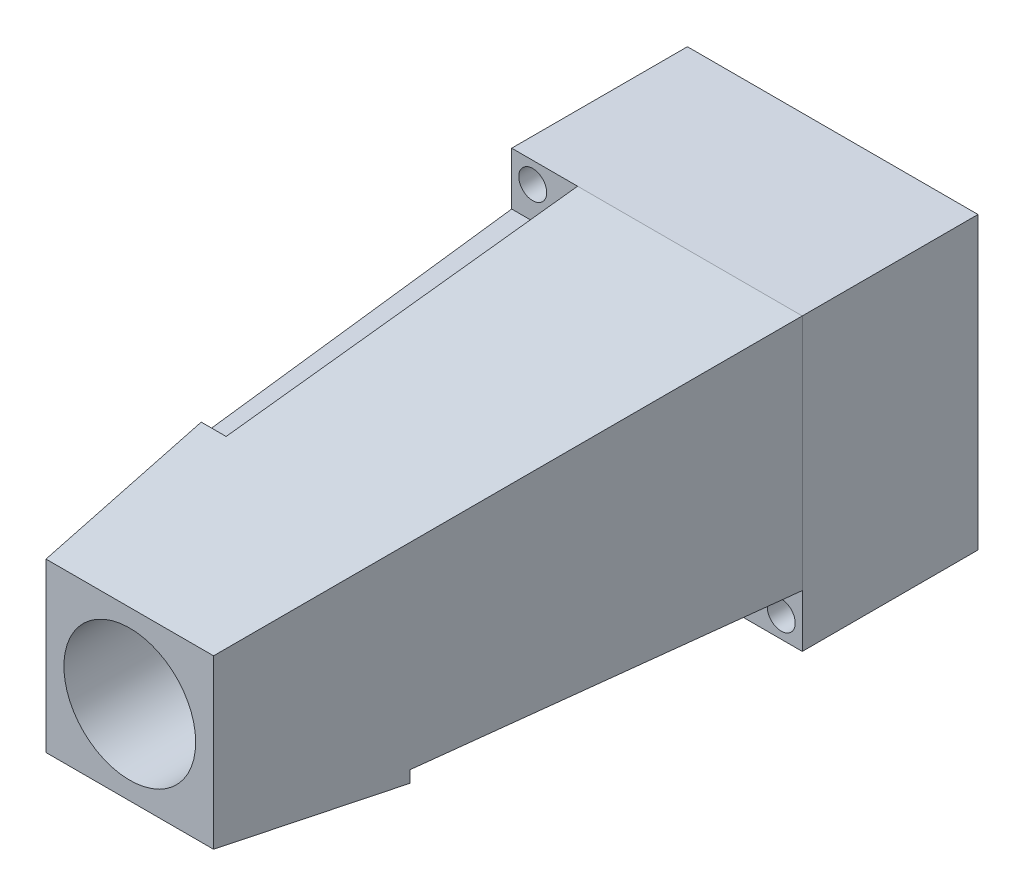
ISO-10303-21;
HEADER;
FILE_DESCRIPTION(('STEP AP214'),'2;1');
FILE_NAME('part.step','',(''),(''),'','','');
FILE_SCHEMA(('AUTOMOTIVE_DESIGN { 1 0 10303 214 1 1 1 1 }'));
ENDSEC;
DATA;
#1=APPLICATION_CONTEXT('core data for automotive mechanical design processes');
#2=APPLICATION_PROTOCOL_DEFINITION('international standard','automotive_design',2000,#1);
#3=PRODUCT_CONTEXT('',#1,'mechanical');
#4=PRODUCT('Part','Part','',(#3));
#5=PRODUCT_RELATED_PRODUCT_CATEGORY('part','',(#4));
#6=PRODUCT_DEFINITION_FORMATION('','',#4);
#7=PRODUCT_DEFINITION_CONTEXT('part definition',#1,'design');
#8=PRODUCT_DEFINITION('design','',#6,#7);
#9=PRODUCT_DEFINITION_SHAPE('','',#8);
#10=(LENGTH_UNIT() NAMED_UNIT(*) SI_UNIT(.MILLI.,.METRE.));
#11=(NAMED_UNIT(*) PLANE_ANGLE_UNIT() SI_UNIT($,.RADIAN.));
#12=(NAMED_UNIT(*) SI_UNIT($,.STERADIAN.) SOLID_ANGLE_UNIT());
#13=UNCERTAINTY_MEASURE_WITH_UNIT(LENGTH_MEASURE(1.E-05),#10,'distance_accuracy_value','');
#14=(GEOMETRIC_REPRESENTATION_CONTEXT(3) GLOBAL_UNCERTAINTY_ASSIGNED_CONTEXT((#13)) GLOBAL_UNIT_ASSIGNED_CONTEXT((#10,
#11,#12)) REPRESENTATION_CONTEXT('',''));
#15=CARTESIAN_POINT('',(0.,0.,0.));
#16=DIRECTION('',(0.,0.,1.));
#17=DIRECTION('',(1.,0.,0.));
#18=AXIS2_PLACEMENT_3D('',#15,#16,#17);
#19=CARTESIAN_POINT('',(0.358381047039892,0.,25.4));
#20=DIRECTION('',(-1.,0.,0.));
#21=DIRECTION('',(0.,-1.,0.));
#22=AXIS2_PLACEMENT_3D('',#19,#20,#21);
#23=PLANE('',#22);
#24=DIRECTION('',(0.,1.,0.));
#25=VECTOR('',#24,1.);
#26=CARTESIAN_POINT('',(0.358381047039892,0.,0.));
#27=LINE('',#26,#25);
#28=CARTESIAN_POINT('',(0.358381047039916,-94.4618953608133,0.));
#29=VERTEX_POINT('',#28);
#30=CARTESIAN_POINT('',(0.358381047039909,-69.0618953608133,0.));
#31=VERTEX_POINT('',#30);
#32=EDGE_CURVE('E410',#29,#31,#27,.T.);
#33=ORIENTED_EDGE('',*,*,#32,.F.);
#34=DIRECTION('',(0.,0.,-1.));
#35=VECTOR('',#34,1.);
#36=CARTESIAN_POINT('',(0.358381047039916,-94.4618953608133,25.4));
#37=LINE('',#36,#35);
#38=CARTESIAN_POINT('',(0.358381047039916,-94.4618953608133,25.4));
#39=VERTEX_POINT('',#38);
#40=EDGE_CURVE('E429',#39,#29,#37,.T.);
#41=ORIENTED_EDGE('',*,*,#40,.F.);
#42=DIRECTION('',(0.,1.,0.));
#43=VECTOR('',#42,1.);
#44=CARTESIAN_POINT('',(0.358381047039892,0.,25.4));
#45=LINE('',#44,#43);
#46=CARTESIAN_POINT('',(0.358381047039909,-69.0618953608133,25.4));
#47=VERTEX_POINT('',#46);
#48=EDGE_CURVE('E258',#39,#47,#45,.T.);
#49=ORIENTED_EDGE('',*,*,#48,.T.);
#50=DIRECTION('',(0.,0.,-1.));
#51=VECTOR('',#50,1.);
#52=CARTESIAN_POINT('',(0.358381047039909,-69.0618953608133,25.4));
#53=LINE('',#52,#51);
#54=EDGE_CURVE('E422',#47,#31,#53,.T.);
#55=ORIENTED_EDGE('',*,*,#54,.T.);
#56=EDGE_LOOP('',(#33,#41,#49,#55));
#57=FACE_BOUND('',#56,.T.);
#58=ADVANCED_FACE('F45',(#57),#23,.T.);
#59=CARTESIAN_POINT('',(0.,-94.4618953608133,25.4));
#60=DIRECTION('',(0.,-1.,0.));
#61=DIRECTION('',(0.,0.,-1.));
#62=AXIS2_PLACEMENT_3D('',#59,#60,#61);
#63=PLANE('',#62);
#64=DIRECTION('',(-1.,0.,0.));
#65=VECTOR('',#64,1.);
#66=CARTESIAN_POINT('',(0.,-94.4618953608133,0.));
#67=LINE('',#66,#65);
#68=CARTESIAN_POINT('',(-25.0416189529601,-94.4618953608133,0.));
#69=VERTEX_POINT('',#68);
#70=EDGE_CURVE('E413',#29,#69,#67,.T.);
#71=ORIENTED_EDGE('',*,*,#70,.T.);
#72=DIRECTION('',(0.,0.,-1.));
#73=VECTOR('',#72,1.);
#74=CARTESIAN_POINT('',(-25.0416189529601,-94.4618953608133,25.4));
#75=LINE('',#74,#73);
#76=CARTESIAN_POINT('',(-25.0416189529601,-94.4618953608133,25.4));
#77=VERTEX_POINT('',#76);
#78=EDGE_CURVE('E426',#77,#69,#75,.T.);
#79=ORIENTED_EDGE('',*,*,#78,.F.);
#80=DIRECTION('',(-1.,0.,0.));
#81=VECTOR('',#80,1.);
#82=CARTESIAN_POINT('',(0.,-94.4618953608133,25.4));
#83=LINE('',#82,#81);
#84=EDGE_CURVE('E385',#39,#77,#83,.T.);
#85=ORIENTED_EDGE('',*,*,#84,.F.);
#86=ORIENTED_EDGE('',*,*,#40,.T.);
#87=EDGE_LOOP('',(#71,#79,#85,#86));
#88=FACE_BOUND('',#87,.T.);
#89=ADVANCED_FACE('F480',(#88),#63,.F.);
#90=CARTESIAN_POINT('',(-25.0416189529601,0.,25.4));
#91=DIRECTION('',(-1.,0.,0.));
#92=DIRECTION('',(0.,-1.,0.));
#93=AXIS2_PLACEMENT_3D('',#90,#91,#92);
#94=PLANE('',#93);
#95=DIRECTION('',(0.,1.,0.));
#96=VECTOR('',#95,1.);
#97=CARTESIAN_POINT('',(-25.0416189529601,0.,0.));
#98=LINE('',#97,#96);
#99=CARTESIAN_POINT('',(-25.0416189529601,-69.0618953608133,0.));
#100=VERTEX_POINT('',#99);
#101=EDGE_CURVE('E416',#69,#100,#98,.T.);
#102=ORIENTED_EDGE('',*,*,#101,.T.);
#103=DIRECTION('',(0.,0.,-1.));
#104=VECTOR('',#103,1.);
#105=CARTESIAN_POINT('',(-25.0416189529601,-69.0618953608133,25.4));
#106=LINE('',#105,#104);
#107=CARTESIAN_POINT('',(-25.0416189529601,-69.0618953608133,25.4));
#108=VERTEX_POINT('',#107);
#109=EDGE_CURVE('E424',#108,#100,#106,.T.);
#110=ORIENTED_EDGE('',*,*,#109,.F.);
#111=DIRECTION('',(0.,1.,0.));
#112=VECTOR('',#111,1.);
#113=CARTESIAN_POINT('',(-25.0416189529601,0.,25.4));
#114=LINE('',#113,#112);
#115=EDGE_CURVE('E387',#77,#108,#114,.T.);
#116=ORIENTED_EDGE('',*,*,#115,.F.);
#117=ORIENTED_EDGE('',*,*,#78,.T.);
#118=EDGE_LOOP('',(#102,#110,#116,#117));
#119=FACE_BOUND('',#118,.T.);
#120=ADVANCED_FACE('F486',(#119),#94,.F.);
#121=CARTESIAN_POINT('',(-33.3416189530143,0.,25.4));
#122=DIRECTION('',(-1.,0.,0.));
#123=DIRECTION('',(0.,-1.,0.));
#124=AXIS2_PLACEMENT_3D('',#121,#122,#123);
#125=PLANE('',#124);
#126=DIRECTION('',(0.,1.,0.));
#127=VECTOR('',#126,1.);
#128=CARTESIAN_POINT('',(-33.3416189530143,0.,0.));
#129=LINE('',#128,#127);
#130=CARTESIAN_POINT('',(-33.3416189530143,-102.761895360813,0.));
#131=VERTEX_POINT('',#130);
#132=CARTESIAN_POINT('',(-33.3416189530143,-60.7618953608133,0.));
#133=VERTEX_POINT('',#132);
#134=EDGE_CURVE('E398',#131,#133,#129,.T.);
#135=ORIENTED_EDGE('',*,*,#134,.F.);
#136=DIRECTION('',(0.,0.,-1.));
#137=VECTOR('',#136,1.);
#138=CARTESIAN_POINT('',(-33.3416189530143,-102.761895360813,25.4));
#139=LINE('',#138,#137);
#140=CARTESIAN_POINT('',(-33.3416189530143,-102.761895360813,25.4));
#141=VERTEX_POINT('',#140);
#142=EDGE_CURVE('E251',#141,#131,#139,.T.);
#143=ORIENTED_EDGE('',*,*,#142,.F.);
#144=DIRECTION('',(0.,-1.,0.));
#145=VECTOR('',#144,1.);
#146=CARTESIAN_POINT('',(-33.3416189530143,0.,25.4));
#147=LINE('',#146,#145);
#148=CARTESIAN_POINT('',(-33.3416189530143,-68.3818953608133,25.4));
#149=VERTEX_POINT('',#148);
#150=EDGE_CURVE('E241',#141,#149,#147,.F.);
#151=ORIENTED_EDGE('',*,*,#150,.T.);
#152=CARTESIAN_POINT('',(-33.3416189530142,-60.7618953608133,25.4));
#153=VERTEX_POINT('',#152);
#154=EDGE_CURVE('E255',#149,#153,#147,.F.);
#155=ORIENTED_EDGE('',*,*,#154,.T.);
#156=DIRECTION('',(0.,0.,-1.));
#157=VECTOR('',#156,1.);
#158=CARTESIAN_POINT('',(-33.3416189530143,-60.7618953608133,25.4));
#159=LINE('',#158,#157);
#160=EDGE_CURVE('E392',#153,#133,#159,.T.);
#161=ORIENTED_EDGE('',*,*,#160,.T.);
#162=EDGE_LOOP('',(#135,#143,#151,#155,#161));
#163=FACE_BOUND('',#162,.T.);
#164=ADVANCED_FACE('F439',(#163),#125,.T.);
#165=CARTESIAN_POINT('',(0.,-102.761895360813,25.4));
#166=DIRECTION('',(0.,-1.,0.));
#167=DIRECTION('',(0.,0.,-1.));
#168=AXIS2_PLACEMENT_3D('',#165,#166,#167);
#169=PLANE('',#168);
#170=DIRECTION('',(-1.,0.,0.));
#171=VECTOR('',#170,1.);
#172=CARTESIAN_POINT('',(0.,-102.761895360813,0.));
#173=LINE('',#172,#171);
#174=CARTESIAN_POINT('',(8.65838104709408,-102.761895360813,0.));
#175=VERTEX_POINT('',#174);
#176=EDGE_CURVE('E401',#175,#131,#173,.T.);
#177=ORIENTED_EDGE('',*,*,#176,.F.);
#178=DIRECTION('',(0.,0.,-1.));
#179=VECTOR('',#178,1.);
#180=CARTESIAN_POINT('',(8.65838104709408,-102.761895360813,25.4));
#181=LINE('',#180,#179);
#182=CARTESIAN_POINT('',(8.65838104709406,-102.761895360813,25.4));
#183=VERTEX_POINT('',#182);
#184=EDGE_CURVE('E246',#183,#175,#181,.T.);
#185=ORIENTED_EDGE('',*,*,#184,.F.);
#186=DIRECTION('',(1.,0.,0.));
#187=VECTOR('',#186,1.);
#188=CARTESIAN_POINT('',(0.,-102.761895360813,25.4));
#189=LINE('',#188,#187);
#190=CARTESIAN_POINT('',(-0.86661895290592,-102.761895360813,25.4));
#191=VERTEX_POINT('',#190);
#192=EDGE_CURVE('E240',#183,#191,#189,.F.);
#193=ORIENTED_EDGE('',*,*,#192,.T.);
#194=EDGE_CURVE('E234',#191,#141,#189,.F.);
#195=ORIENTED_EDGE('',*,*,#194,.T.);
#196=ORIENTED_EDGE('',*,*,#142,.T.);
#197=EDGE_LOOP('',(#177,#185,#193,#195,#196));
#198=FACE_BOUND('',#197,.T.);
#199=ADVANCED_FACE('F245',(#198),#169,.T.);
#200=CARTESIAN_POINT('',(8.65838104709408,0.,25.4));
#201=DIRECTION('',(-1.,0.,0.));
#202=DIRECTION('',(0.,-1.,0.));
#203=AXIS2_PLACEMENT_3D('',#200,#201,#202);
#204=PLANE('',#203);
#205=DIRECTION('',(0.,1.,0.));
#206=VECTOR('',#205,1.);
#207=CARTESIAN_POINT('',(8.65838104709408,0.,0.));
#208=LINE('',#207,#206);
#209=CARTESIAN_POINT('',(8.65838104709408,-60.7618953608133,0.));
#210=VERTEX_POINT('',#209);
#211=EDGE_CURVE('E404',#175,#210,#208,.T.);
#212=ORIENTED_EDGE('',*,*,#211,.T.);
#213=DIRECTION('',(0.,0.,-1.));
#214=VECTOR('',#213,1.);
#215=CARTESIAN_POINT('',(8.65838104709408,-60.7618953608133,25.4));
#216=LINE('',#215,#214);
#217=CARTESIAN_POINT('',(8.65838104709408,-60.7618953608133,25.4));
#218=VERTEX_POINT('',#217);
#219=EDGE_CURVE('E432',#218,#210,#216,.T.);
#220=ORIENTED_EDGE('',*,*,#219,.F.);
#221=DIRECTION('',(0.,1.,0.));
#222=VECTOR('',#221,1.);
#223=CARTESIAN_POINT('',(8.65838104709408,0.,25.4));
#224=LINE('',#223,#222);
#225=CARTESIAN_POINT('',(8.65838104709408,-95.1418953608132,25.4));
#226=VERTEX_POINT('',#225);
#227=EDGE_CURVE('E247',#226,#218,#224,.T.);
#228=ORIENTED_EDGE('',*,*,#227,.F.);
#229=EDGE_CURVE('E178',#183,#226,#224,.T.);
#230=ORIENTED_EDGE('',*,*,#229,.F.);
#231=ORIENTED_EDGE('',*,*,#184,.T.);
#232=EDGE_LOOP('',(#212,#220,#228,#230,#231));
#233=FACE_BOUND('',#232,.T.);
#234=ADVANCED_FACE('F445',(#233),#204,.F.);
#235=CARTESIAN_POINT('',(0.,-60.7618953608133,25.4));
#236=DIRECTION('',(0.,-1.,0.));
#237=DIRECTION('',(0.,0.,-1.));
#238=AXIS2_PLACEMENT_3D('',#235,#236,#237);
#239=PLANE('',#238);
#240=DIRECTION('',(-1.,0.,0.));
#241=VECTOR('',#240,1.);
#242=CARTESIAN_POINT('',(0.,-60.7618953608133,0.));
#243=LINE('',#242,#241);
#244=EDGE_CURVE('E407',#210,#133,#243,.T.);
#245=ORIENTED_EDGE('',*,*,#244,.T.);
#246=ORIENTED_EDGE('',*,*,#160,.F.);
#247=DIRECTION('',(-1.,0.,0.));
#248=VECTOR('',#247,1.);
#249=CARTESIAN_POINT('',(-23.8166189530143,-60.7618953608133,25.4));
#250=LINE('',#249,#248);
#251=CARTESIAN_POINT('',(-23.8166189530143,-60.7618953608133,25.4));
#252=VERTEX_POINT('',#251);
#253=EDGE_CURVE('E192',#252,#153,#250,.T.);
#254=ORIENTED_EDGE('',*,*,#253,.F.);
#255=DIRECTION('',(1.,0.,0.));
#256=VECTOR('',#255,1.);
#257=CARTESIAN_POINT('',(0.,-60.7618953608133,25.4));
#258=LINE('',#257,#256);
#259=EDGE_CURVE('E256',#218,#252,#258,.F.);
#260=ORIENTED_EDGE('',*,*,#259,.F.);
#261=ORIENTED_EDGE('',*,*,#219,.T.);
#262=EDGE_LOOP('',(#245,#246,#254,#260,#261));
#263=FACE_BOUND('',#262,.T.);
#264=ADVANCED_FACE('F453',(#263),#239,.F.);
#265=CARTESIAN_POINT('',(-30.3021311950443,-63.801383118675,25.4));
#266=DIRECTION('',(0.,0.,-1.));
#267=DIRECTION('',(-1.,0.,0.));
#268=AXIS2_PLACEMENT_3D('',#265,#266,#267);
#269=CYLINDRICAL_SURFACE('',#268,2.01930000012077);
#270=CARTESIAN_POINT('',(-30.3021311950443,-63.801383118675,25.4));
#271=DIRECTION('',(0.,0.,1.));
#272=DIRECTION('',(1.,0.,0.));
#273=AXIS2_PLACEMENT_3D('',#270,#271,#272);
#274=CIRCLE('',#273,2.01930000012077);
#275=CARTESIAN_POINT('',(-28.2828311949235,-63.801383118675,25.4));
#276=VERTEX_POINT('',#275);
#277=EDGE_CURVE('E203',#276,#276,#274,.T.);
#278=ORIENTED_EDGE('',*,*,#277,.T.);
#279=EDGE_LOOP('',(#278));
#280=FACE_BOUND('',#279,.T.);
#281=CARTESIAN_POINT('',(-30.3021311950443,-63.801383118675,0.));
#282=DIRECTION('',(0.,0.,1.));
#283=DIRECTION('',(1.,0.,0.));
#284=AXIS2_PLACEMENT_3D('',#281,#282,#283);
#285=CIRCLE('',#284,2.01930000012077);
#286=CARTESIAN_POINT('',(-28.2828311949235,-63.801383118675,0.));
#287=VERTEX_POINT('',#286);
#288=EDGE_CURVE('E395',#287,#287,#285,.T.);
#289=ORIENTED_EDGE('',*,*,#288,.F.);
#290=EDGE_LOOP('',(#289));
#291=FACE_BOUND('',#290,.T.);
#292=ADVANCED_FACE('F494',(#280,#291),#269,.F.);
#293=CARTESIAN_POINT('',(5.61889328923248,-99.7224076029515,25.4));
#294=DIRECTION('',(0.,0.,-1.));
#295=DIRECTION('',(-1.,0.,0.));
#296=AXIS2_PLACEMENT_3D('',#293,#294,#295);
#297=CYLINDRICAL_SURFACE('',#296,2.01930000012066);
#298=CARTESIAN_POINT('',(5.61889328923248,-99.7224076029515,25.4));
#299=DIRECTION('',(0.,0.,1.));
#300=DIRECTION('',(1.,0.,0.));
#301=AXIS2_PLACEMENT_3D('',#298,#299,#300);
#302=CIRCLE('',#301,2.01930000012066);
#303=CARTESIAN_POINT('',(7.63819328935314,-99.7224076029515,25.4));
#304=VERTEX_POINT('',#303);
#305=EDGE_CURVE('E187',#304,#304,#302,.T.);
#306=ORIENTED_EDGE('',*,*,#305,.T.);
#307=EDGE_LOOP('',(#306));
#308=FACE_BOUND('',#307,.T.);
#309=CARTESIAN_POINT('',(5.61889328923248,-99.7224076029515,0.));
#310=DIRECTION('',(0.,0.,1.));
#311=DIRECTION('',(1.,0.,0.));
#312=AXIS2_PLACEMENT_3D('',#309,#310,#311);
#313=CIRCLE('',#312,2.01930000012066);
#314=CARTESIAN_POINT('',(7.63819328935314,-99.7224076029515,0.));
#315=VERTEX_POINT('',#314);
#316=EDGE_CURVE('E327',#315,#315,#313,.T.);
#317=ORIENTED_EDGE('',*,*,#316,.F.);
#318=EDGE_LOOP('',(#317));
#319=FACE_BOUND('',#318,.T.);
#320=ADVANCED_FACE('F47',(#308,#319),#297,.F.);
#321=CARTESIAN_POINT('',(0.,-69.0618953608133,25.4));
#322=DIRECTION('',(0.,-1.,0.));
#323=DIRECTION('',(0.,0.,-1.));
#324=AXIS2_PLACEMENT_3D('',#321,#322,#323);
#325=PLANE('',#324);
#326=DIRECTION('',(-1.,0.,0.));
#327=VECTOR('',#326,1.);
#328=CARTESIAN_POINT('',(0.,-69.0618953608133,0.));
#329=LINE('',#328,#327);
#330=EDGE_CURVE('E419',#31,#100,#329,.T.);
#331=ORIENTED_EDGE('',*,*,#330,.F.);
#332=ORIENTED_EDGE('',*,*,#54,.F.);
#333=DIRECTION('',(-1.,0.,0.));
#334=VECTOR('',#333,1.);
#335=CARTESIAN_POINT('',(0.,-69.0618953608133,25.4));
#336=LINE('',#335,#334);
#337=EDGE_CURVE('E389',#47,#108,#336,.T.);
#338=ORIENTED_EDGE('',*,*,#337,.T.);
#339=ORIENTED_EDGE('',*,*,#109,.T.);
#340=EDGE_LOOP('',(#331,#332,#338,#339));
#341=FACE_BOUND('',#340,.T.);
#342=ADVANCED_FACE('F505',(#341),#325,.T.);
#343=CARTESIAN_POINT('',(0.,0.,0.));
#344=DIRECTION('',(0.,0.,1.));
#345=DIRECTION('',(1.,0.,0.));
#346=AXIS2_PLACEMENT_3D('',#343,#344,#345);
#347=PLANE('',#346);
#348=ORIENTED_EDGE('',*,*,#316,.T.);
#349=EDGE_LOOP('',(#348));
#350=FACE_BOUND('',#349,.T.);
#351=ORIENTED_EDGE('',*,*,#288,.T.);
#352=EDGE_LOOP('',(#351));
#353=FACE_BOUND('',#352,.T.);
#354=ORIENTED_EDGE('',*,*,#134,.T.);
#355=ORIENTED_EDGE('',*,*,#244,.F.);
#356=ORIENTED_EDGE('',*,*,#211,.F.);
#357=ORIENTED_EDGE('',*,*,#176,.T.);
#358=EDGE_LOOP('',(#354,#355,#356,#357));
#359=FACE_BOUND('',#358,.T.);
#360=ORIENTED_EDGE('',*,*,#32,.T.);
#361=ORIENTED_EDGE('',*,*,#330,.T.);
#362=ORIENTED_EDGE('',*,*,#101,.F.);
#363=ORIENTED_EDGE('',*,*,#70,.F.);
#364=EDGE_LOOP('',(#360,#361,#362,#363));
#365=FACE_BOUND('',#364,.T.);
#366=ADVANCED_FACE('F350',(#350,#353,#359,#365),#347,.F.);
#367=CARTESIAN_POINT('',(0.,0.,25.4));
#368=DIRECTION('',(0.,0.,-1.));
#369=DIRECTION('',(-1.,0.,0.));
#370=AXIS2_PLACEMENT_3D('',#367,#368,#369);
#371=PLANE('',#370);
#372=CARTESIAN_POINT('',(-12.3416189528054,-81.7618953608125,25.4));
#373=DIRECTION('',(0.,0.,-1.));
#374=DIRECTION('',(-1.,0.,0.));
#375=AXIS2_PLACEMENT_3D('',#372,#373,#374);
#376=CIRCLE('',#375,9.52500000000001);
#377=CARTESIAN_POINT('',(-21.8666189528054,-81.7618953608125,25.4));
#378=VERTEX_POINT('',#377);
#379=EDGE_CURVE('E212',#378,#378,#376,.T.);
#380=ORIENTED_EDGE('',*,*,#379,.F.);
#381=EDGE_LOOP('',(#380));
#382=FACE_BOUND('',#381,.T.);
#383=ORIENTED_EDGE('',*,*,#48,.F.);
#384=ORIENTED_EDGE('',*,*,#84,.T.);
#385=ORIENTED_EDGE('',*,*,#115,.T.);
#386=ORIENTED_EDGE('',*,*,#337,.F.);
#387=EDGE_LOOP('',(#383,#384,#385,#386));
#388=FACE_BOUND('',#387,.T.);
#389=ADVANCED_FACE('F348',(#382,#388),#371,.T.);
#390=CARTESIAN_POINT('',(0.,0.,101.6));
#391=DIRECTION('',(0.,0.,-1.));
#392=DIRECTION('',(-1.,0.,0.));
#393=AXIS2_PLACEMENT_3D('',#390,#391,#392);
#394=PLANE('',#393);
#395=CARTESIAN_POINT('',(-12.3416189528054,-81.7618953608125,101.6));
#396=DIRECTION('',(0.,0.,1.));
#397=DIRECTION('',(1.,0.,0.));
#398=AXIS2_PLACEMENT_3D('',#395,#396,#397);
#399=CIRCLE('',#398,9.52500000000001);
#400=CARTESIAN_POINT('',(-2.81661895280538,-81.7618953608125,101.6));
#401=VERTEX_POINT('',#400);
#402=EDGE_CURVE('E209',#401,#401,#399,.T.);
#403=ORIENTED_EDGE('',*,*,#402,.F.);
#404=EDGE_LOOP('',(#403));
#405=FACE_BOUND('',#404,.T.);
#406=DIRECTION('',(1.,0.,0.));
#407=VECTOR('',#406,1.);
#408=CARTESIAN_POINT('',(-0.231618952805554,-93.8718953608125,101.6));
#409=LINE('',#408,#407);
#410=CARTESIAN_POINT('',(-24.4516189528052,-93.8718953608125,101.6));
#411=VERTEX_POINT('',#410);
#412=CARTESIAN_POINT('',(-0.231618952805554,-93.8718953608125,101.6));
#413=VERTEX_POINT('',#412);
#414=EDGE_CURVE('E224',#411,#413,#409,.T.);
#415=ORIENTED_EDGE('',*,*,#414,.T.);
#416=DIRECTION('',(0.,1.,0.));
#417=VECTOR('',#416,1.);
#418=CARTESIAN_POINT('',(-0.231618952805554,-93.8718953608125,101.6));
#419=LINE('',#418,#417);
#420=CARTESIAN_POINT('',(-0.231618952805554,-69.6518953608125,101.6));
#421=VERTEX_POINT('',#420);
#422=EDGE_CURVE('E273',#413,#421,#419,.T.);
#423=ORIENTED_EDGE('',*,*,#422,.T.);
#424=DIRECTION('',(-1.,0.,0.));
#425=VECTOR('',#424,1.);
#426=CARTESIAN_POINT('',(-0.231618952805554,-69.6518953608125,101.6));
#427=LINE('',#426,#425);
#428=CARTESIAN_POINT('',(-24.4516189528052,-69.6518953608125,101.6));
#429=VERTEX_POINT('',#428);
#430=EDGE_CURVE('E328',#421,#429,#427,.T.);
#431=ORIENTED_EDGE('',*,*,#430,.T.);
#432=DIRECTION('',(0.,-1.,0.));
#433=VECTOR('',#432,1.);
#434=CARTESIAN_POINT('',(-24.4516189528052,-93.8718953608125,101.6));
#435=LINE('',#434,#433);
#436=EDGE_CURVE('E364',#429,#411,#435,.T.);
#437=ORIENTED_EDGE('',*,*,#436,.T.);
#438=EDGE_LOOP('',(#415,#423,#431,#437));
#439=FACE_BOUND('',#438,.T.);
#440=ADVANCED_FACE('F339',(#405,#439),#394,.F.);
#441=CARTESIAN_POINT('',(0.,-57.0224234855931,-6.65261607331861));
#442=DIRECTION('',(0.,-0.993263139087244,-0.115880699560168));
#443=DIRECTION('',(0.,0.115880699560168,-0.993263139087244));
#444=AXIS2_PLACEMENT_3D('',#441,#442,#443);
#445=PLANE('',#444);
#446=ORIENTED_EDGE('',*,*,#259,.T.);
#447=DIRECTION('',(0.,-0.115880699560168,0.993263139087244));
#448=VECTOR('',#447,1.);
#449=CARTESIAN_POINT('',(-23.8166189530142,-57.0224234855931,-6.65261607331862));
#450=LINE('',#449,#448);
#451=CARTESIAN_POINT('',(-23.8166189530143,-66.6885620274794,76.2));
#452=VERTEX_POINT('',#451);
#453=EDGE_CURVE('E226',#252,#452,#450,.T.);
#454=ORIENTED_EDGE('',*,*,#453,.T.);
#455=DIRECTION('',(-1.,0.,0.));
#456=VECTOR('',#455,1.);
#457=CARTESIAN_POINT('',(0.,-66.6885620274794,76.2));
#458=LINE('',#457,#456);
#459=CARTESIAN_POINT('',(-27.4149522862082,-66.6885620274794,76.2));
#460=VERTEX_POINT('',#459);
#461=EDGE_CURVE('E206',#452,#460,#458,.T.);
#462=ORIENTED_EDGE('',*,*,#461,.T.);
#463=DIRECTION('',(0.115110406242341,-0.115110406239625,0.986660624911155));
#464=VECTOR('',#463,1.);
#465=CARTESIAN_POINT('',(-33.3416189530143,-60.7618953608133,25.4));
#466=LINE('',#465,#464);
#467=EDGE_CURVE('E215',#460,#429,#466,.T.);
#468=ORIENTED_EDGE('',*,*,#467,.T.);
#469=ORIENTED_EDGE('',*,*,#430,.F.);
#470=DIRECTION('',(-0.115110406238388,-0.115110406239678,0.98666062491161));
#471=VECTOR('',#470,1.);
#472=CARTESIAN_POINT('',(8.65838104709408,-60.7618953608133,25.4));
#473=LINE('',#472,#471);
#474=EDGE_CURVE('E218',#218,#421,#473,.T.);
#475=ORIENTED_EDGE('',*,*,#474,.F.);
#476=EDGE_LOOP('',(#446,#454,#462,#468,#469,#475));
#477=FACE_BOUND('',#476,.T.);
#478=ADVANCED_FACE('F292',(#477),#445,.F.);
#479=CARTESIAN_POINT('',(11.4656540886355,0.,1.33765964365904));
#480=DIRECTION('',(-0.993263139087393,0.,-0.115880699558888));
#481=DIRECTION('',(-0.115880699558888,0.,0.993263139087393));
#482=AXIS2_PLACEMENT_3D('',#479,#480,#481);
#483=PLANE('',#482);
#484=DIRECTION('',(-0.115110406238388,0.115110406239698,0.986660624911608));
#485=VECTOR('',#484,1.);
#486=CARTESIAN_POINT('',(8.65838104709408,-102.761895360813,25.4));
#487=LINE('',#486,#485);
#488=CARTESIAN_POINT('',(2.73171438049433,-96.8352286941461,76.2));
#489=VERTEX_POINT('',#488);
#490=EDGE_CURVE('E221',#489,#413,#487,.T.);
#491=ORIENTED_EDGE('',*,*,#490,.F.);
#492=DIRECTION('',(0.,1.,0.));
#493=VECTOR('',#492,1.);
#494=CARTESIAN_POINT('',(2.73171438049433,0.,76.2));
#495=LINE('',#494,#493);
#496=CARTESIAN_POINT('',(2.73171438049433,-95.1418953608132,76.2));
#497=VERTEX_POINT('',#496);
#498=EDGE_CURVE('E189',#489,#497,#495,.T.);
#499=ORIENTED_EDGE('',*,*,#498,.T.);
#500=DIRECTION('',(0.115880699558888,0.,-0.993263139087393));
#501=VECTOR('',#500,1.);
#502=CARTESIAN_POINT('',(11.4656540886355,-95.1418953608132,1.33765964365904));
#503=LINE('',#502,#501);
#504=EDGE_CURVE('E12',#497,#226,#503,.T.);
#505=ORIENTED_EDGE('',*,*,#504,.T.);
#506=ORIENTED_EDGE('',*,*,#227,.T.);
#507=ORIENTED_EDGE('',*,*,#474,.T.);
#508=ORIENTED_EDGE('',*,*,#422,.F.);
#509=EDGE_LOOP('',(#491,#499,#505,#506,#507,#508));
#510=FACE_BOUND('',#509,.T.);
#511=ADVANCED_FACE('F281',(#510),#483,.F.);
#512=CARTESIAN_POINT('',(-35.8174371693668,0.,4.17870100319105));
#513=DIRECTION('',(0.993263139086929,0.,-0.115880699562866));
#514=DIRECTION('',(-0.115880699562866,0.,-0.993263139086929));
#515=AXIS2_PLACEMENT_3D('',#512,#513,#514);
#516=PLANE('',#515);
#517=ORIENTED_EDGE('',*,*,#467,.F.);
#518=DIRECTION('',(0.,-1.,0.));
#519=VECTOR('',#518,1.);
#520=CARTESIAN_POINT('',(-27.4149522862082,0.,76.2));
#521=LINE('',#520,#519);
#522=CARTESIAN_POINT('',(-27.4149522862082,-68.3818953608133,76.2));
#523=VERTEX_POINT('',#522);
#524=EDGE_CURVE('E460',#460,#523,#521,.T.);
#525=ORIENTED_EDGE('',*,*,#524,.T.);
#526=DIRECTION('',(-0.115880699562866,0.,-0.993263139086929));
#527=VECTOR('',#526,1.);
#528=CARTESIAN_POINT('',(-35.8174371693668,-68.3818953608133,4.17870100319105));
#529=LINE('',#528,#527);
#530=EDGE_CURVE('E262',#523,#149,#529,.T.);
#531=ORIENTED_EDGE('',*,*,#530,.T.);
#532=ORIENTED_EDGE('',*,*,#150,.F.);
#533=DIRECTION('',(0.115110406242341,0.115110406239645,0.986660624911153));
#534=VECTOR('',#533,1.);
#535=CARTESIAN_POINT('',(-33.3416189530143,-102.761895360813,25.4));
#536=LINE('',#535,#534);
#537=EDGE_CURVE('E225',#141,#411,#536,.T.);
#538=ORIENTED_EDGE('',*,*,#537,.T.);
#539=ORIENTED_EDGE('',*,*,#436,.F.);
#540=EDGE_LOOP('',(#517,#525,#531,#532,#538,#539));
#541=FACE_BOUND('',#540,.T.);
#542=ADVANCED_FACE('F291',(#541),#516,.F.);
#543=CARTESIAN_POINT('',(0.,-104.305514743472,12.1689767200727));
#544=DIRECTION('',(0.,0.993263139087242,-0.115880699560188));
#545=DIRECTION('',(0.,0.115880699560188,0.993263139087242));
#546=AXIS2_PLACEMENT_3D('',#543,#544,#545);
#547=PLANE('',#546);
#548=ORIENTED_EDGE('',*,*,#194,.F.);
#549=DIRECTION('',(0.,0.115880699560188,0.993263139087242));
#550=VECTOR('',#549,1.);
#551=CARTESIAN_POINT('',(-0.866618952905918,-104.305514743472,12.1689767200727));
#552=LINE('',#551,#550);
#553=CARTESIAN_POINT('',(-0.86661895290592,-96.8352286941461,76.2));
#554=VERTEX_POINT('',#553);
#555=EDGE_CURVE('E53',#191,#554,#552,.T.);
#556=ORIENTED_EDGE('',*,*,#555,.T.);
#557=DIRECTION('',(1.,0.,0.));
#558=VECTOR('',#557,1.);
#559=CARTESIAN_POINT('',(0.,-96.8352286941461,76.2));
#560=LINE('',#559,#558);
#561=EDGE_CURVE('E228',#554,#489,#560,.T.);
#562=ORIENTED_EDGE('',*,*,#561,.T.);
#563=ORIENTED_EDGE('',*,*,#490,.T.);
#564=ORIENTED_EDGE('',*,*,#414,.F.);
#565=ORIENTED_EDGE('',*,*,#537,.F.);
#566=EDGE_LOOP('',(#548,#556,#562,#563,#564,#565));
#567=FACE_BOUND('',#566,.T.);
#568=ADVANCED_FACE('F231',(#567),#547,.F.);
#569=CARTESIAN_POINT('',(-12.3416189528054,-81.7618953608125,0.));
#570=DIRECTION('',(0.,0.,1.));
#571=DIRECTION('',(1.,0.,0.));
#572=AXIS2_PLACEMENT_3D('',#569,#570,#571);
#573=CYLINDRICAL_SURFACE('',#572,9.52500000000001);
#574=ORIENTED_EDGE('',*,*,#379,.T.);
#575=EDGE_LOOP('',(#574));
#576=FACE_BOUND('',#575,.T.);
#577=ORIENTED_EDGE('',*,*,#402,.T.);
#578=EDGE_LOOP('',(#577));
#579=FACE_BOUND('',#578,.T.);
#580=ADVANCED_FACE('F583',(#576,#579),#573,.F.);
#581=CARTESIAN_POINT('',(-23.8166189530143,-68.3818953608133,25.4));
#582=DIRECTION('',(1.,0.,0.));
#583=DIRECTION('',(0.,0.,-1.));
#584=AXIS2_PLACEMENT_3D('',#581,#582,#583);
#585=PLANE('',#584);
#586=DIRECTION('',(0.,1.,0.));
#587=VECTOR('',#586,1.);
#588=CARTESIAN_POINT('',(-23.8166189530143,-68.3818953608133,25.4));
#589=LINE('',#588,#587);
#590=CARTESIAN_POINT('',(-23.8166189530143,-68.3818953608133,25.4));
#591=VERTEX_POINT('',#590);
#592=EDGE_CURVE('E198',#591,#252,#589,.T.);
#593=ORIENTED_EDGE('',*,*,#592,.F.);
#594=DIRECTION('',(0.,0.,-1.));
#595=VECTOR('',#594,1.);
#596=CARTESIAN_POINT('',(-23.8166189530143,-68.3818953608133,25.4));
#597=LINE('',#596,#595);
#598=CARTESIAN_POINT('',(-23.8166189530143,-68.3818953608133,76.2));
#599=VERTEX_POINT('',#598);
#600=EDGE_CURVE('E193',#599,#591,#597,.T.);
#601=ORIENTED_EDGE('',*,*,#600,.F.);
#602=DIRECTION('',(0.,1.,0.));
#603=VECTOR('',#602,1.);
#604=CARTESIAN_POINT('',(-23.8166189530143,-68.3818953608133,76.2));
#605=LINE('',#604,#603);
#606=EDGE_CURVE('E200',#599,#452,#605,.T.);
#607=ORIENTED_EDGE('',*,*,#606,.T.);
#608=ORIENTED_EDGE('',*,*,#453,.F.);
#609=EDGE_LOOP('',(#593,#601,#607,#608));
#610=FACE_BOUND('',#609,.T.);
#611=ADVANCED_FACE('F463',(#610),#585,.F.);
#612=CARTESIAN_POINT('',(-23.8166189530143,-68.3818953608133,76.2));
#613=DIRECTION('',(0.,0.,1.));
#614=DIRECTION('',(1.,0.,0.));
#615=AXIS2_PLACEMENT_3D('',#612,#613,#614);
#616=PLANE('',#615);
#617=ORIENTED_EDGE('',*,*,#606,.F.);
#618=DIRECTION('',(1.,0.,0.));
#619=VECTOR('',#618,1.);
#620=CARTESIAN_POINT('',(-23.8166189530143,-68.3818953608133,76.2));
#621=LINE('',#620,#619);
#622=EDGE_CURVE('E196',#523,#599,#621,.T.);
#623=ORIENTED_EDGE('',*,*,#622,.F.);
#624=ORIENTED_EDGE('',*,*,#524,.F.);
#625=ORIENTED_EDGE('',*,*,#461,.F.);
#626=EDGE_LOOP('',(#617,#623,#624,#625));
#627=FACE_BOUND('',#626,.T.);
#628=ADVANCED_FACE('F467',(#627),#616,.F.);
#629=CARTESIAN_POINT('',(-23.8166189530143,-68.3818953608133,25.4));
#630=DIRECTION('',(0.,0.,-1.));
#631=DIRECTION('',(-1.,0.,0.));
#632=AXIS2_PLACEMENT_3D('',#629,#630,#631);
#633=PLANE('',#632);
#634=DIRECTION('',(-1.,0.,0.));
#635=VECTOR('',#634,1.);
#636=CARTESIAN_POINT('',(-23.8166189530143,-68.3818953608133,25.4));
#637=LINE('',#636,#635);
#638=EDGE_CURVE('E68',#591,#149,#637,.T.);
#639=ORIENTED_EDGE('',*,*,#638,.F.);
#640=ORIENTED_EDGE('',*,*,#592,.T.);
#641=ORIENTED_EDGE('',*,*,#253,.T.);
#642=ORIENTED_EDGE('',*,*,#154,.F.);
#643=EDGE_LOOP('',(#639,#640,#641,#642));
#644=FACE_BOUND('',#643,.T.);
#645=ORIENTED_EDGE('',*,*,#277,.F.);
#646=EDGE_LOOP('',(#645));
#647=FACE_BOUND('',#646,.T.);
#648=ADVANCED_FACE('F455',(#644,#647),#633,.F.);
#649=CARTESIAN_POINT('',(0.,-68.3818953608133,0.));
#650=DIRECTION('',(0.,-1.,0.));
#651=DIRECTION('',(0.,0.,-1.));
#652=AXIS2_PLACEMENT_3D('',#649,#650,#651);
#653=PLANE('',#652);
#654=ORIENTED_EDGE('',*,*,#622,.T.);
#655=ORIENTED_EDGE('',*,*,#600,.T.);
#656=ORIENTED_EDGE('',*,*,#638,.T.);
#657=ORIENTED_EDGE('',*,*,#530,.F.);
#658=EDGE_LOOP('',(#654,#655,#656,#657));
#659=FACE_BOUND('',#658,.T.);
#660=ADVANCED_FACE('F468',(#659),#653,.F.);
#661=CARTESIAN_POINT('',(0.,-95.1418953608132,0.));
#662=DIRECTION('',(0.,1.,0.));
#663=DIRECTION('',(0.,0.,1.));
#664=AXIS2_PLACEMENT_3D('',#661,#662,#663);
#665=PLANE('',#664);
#666=DIRECTION('',(-1.,0.,0.));
#667=VECTOR('',#666,1.);
#668=CARTESIAN_POINT('',(-0.86661895290592,-95.1418953608132,76.2));
#669=LINE('',#668,#667);
#670=CARTESIAN_POINT('',(-0.86661895290592,-95.1418953608132,76.2));
#671=VERTEX_POINT('',#670);
#672=EDGE_CURVE('E171',#497,#671,#669,.T.);
#673=ORIENTED_EDGE('',*,*,#672,.T.);
#674=DIRECTION('',(0.,0.,-1.));
#675=VECTOR('',#674,1.);
#676=CARTESIAN_POINT('',(-0.866618952905919,-95.1418953608132,25.4));
#677=LINE('',#676,#675);
#678=CARTESIAN_POINT('',(-0.866618952905919,-95.1418953608132,25.4));
#679=VERTEX_POINT('',#678);
#680=EDGE_CURVE('E167',#671,#679,#677,.T.);
#681=ORIENTED_EDGE('',*,*,#680,.T.);
#682=DIRECTION('',(1.,0.,0.));
#683=VECTOR('',#682,1.);
#684=CARTESIAN_POINT('',(-0.866618952905919,-95.1418953608132,25.4));
#685=LINE('',#684,#683);
#686=EDGE_CURVE('E174',#679,#226,#685,.T.);
#687=ORIENTED_EDGE('',*,*,#686,.T.);
#688=ORIENTED_EDGE('',*,*,#504,.F.);
#689=EDGE_LOOP('',(#673,#681,#687,#688));
#690=FACE_BOUND('',#689,.T.);
#691=ADVANCED_FACE('F181',(#690),#665,.F.);
#692=CARTESIAN_POINT('',(-0.866618952905919,-95.1418953608132,25.4));
#693=DIRECTION('',(-1.,0.,0.));
#694=DIRECTION('',(0.,0.,1.));
#695=AXIS2_PLACEMENT_3D('',#692,#693,#694);
#696=PLANE('',#695);
#697=DIRECTION('',(0.,-1.,0.));
#698=VECTOR('',#697,1.);
#699=CARTESIAN_POINT('',(-0.866618952905919,-95.1418953608132,25.4));
#700=LINE('',#699,#698);
#701=EDGE_CURVE('E60',#679,#191,#700,.T.);
#702=ORIENTED_EDGE('',*,*,#701,.F.);
#703=ORIENTED_EDGE('',*,*,#680,.F.);
#704=DIRECTION('',(0.,-1.,0.));
#705=VECTOR('',#704,1.);
#706=CARTESIAN_POINT('',(-0.86661895290592,-95.1418953608132,76.2));
#707=LINE('',#706,#705);
#708=EDGE_CURVE('E170',#671,#554,#707,.T.);
#709=ORIENTED_EDGE('',*,*,#708,.T.);
#710=ORIENTED_EDGE('',*,*,#555,.F.);
#711=EDGE_LOOP('',(#702,#703,#709,#710));
#712=FACE_BOUND('',#711,.T.);
#713=ADVANCED_FACE('F164',(#712),#696,.F.);
#714=CARTESIAN_POINT('',(-0.86661895290592,-95.1418953608132,76.2));
#715=DIRECTION('',(0.,0.,1.));
#716=DIRECTION('',(1.,0.,0.));
#717=AXIS2_PLACEMENT_3D('',#714,#715,#716);
#718=PLANE('',#717);
#719=ORIENTED_EDGE('',*,*,#561,.F.);
#720=ORIENTED_EDGE('',*,*,#708,.F.);
#721=ORIENTED_EDGE('',*,*,#672,.F.);
#722=ORIENTED_EDGE('',*,*,#498,.F.);
#723=EDGE_LOOP('',(#719,#720,#721,#722));
#724=FACE_BOUND('',#723,.T.);
#725=ADVANCED_FACE('F618',(#724),#718,.F.);
#726=CARTESIAN_POINT('',(-0.866618952905919,-95.1418953608132,25.4));
#727=DIRECTION('',(0.,0.,-1.));
#728=DIRECTION('',(-1.,0.,0.));
#729=AXIS2_PLACEMENT_3D('',#726,#727,#728);
#730=PLANE('',#729);
#731=ORIENTED_EDGE('',*,*,#686,.F.);
#732=ORIENTED_EDGE('',*,*,#701,.T.);
#733=ORIENTED_EDGE('',*,*,#192,.F.);
#734=ORIENTED_EDGE('',*,*,#229,.T.);
#735=EDGE_LOOP('',(#731,#732,#733,#734));
#736=FACE_BOUND('',#735,.T.);
#737=ORIENTED_EDGE('',*,*,#305,.F.);
#738=EDGE_LOOP('',(#737));
#739=FACE_BOUND('',#738,.T.);
#740=ADVANCED_FACE('F175',(#736,#739),#730,.F.);
#741=CLOSED_SHELL('',(#58,#89,#120,#164,#199,#234,#264,#292,#320,#342,#366,#389,#440,#478,#511,
#542,#568,#580,#611,#628,#648,#660,#691,#713,#725,#740));
#742=MANIFOLD_SOLID_BREP('B2',#741);
#743=ADVANCED_BREP_SHAPE_REPRESENTATION('',(#18,#742),#14);
#744=SHAPE_DEFINITION_REPRESENTATION(#9,#743);
ENDSEC;
END-ISO-10303-21;
